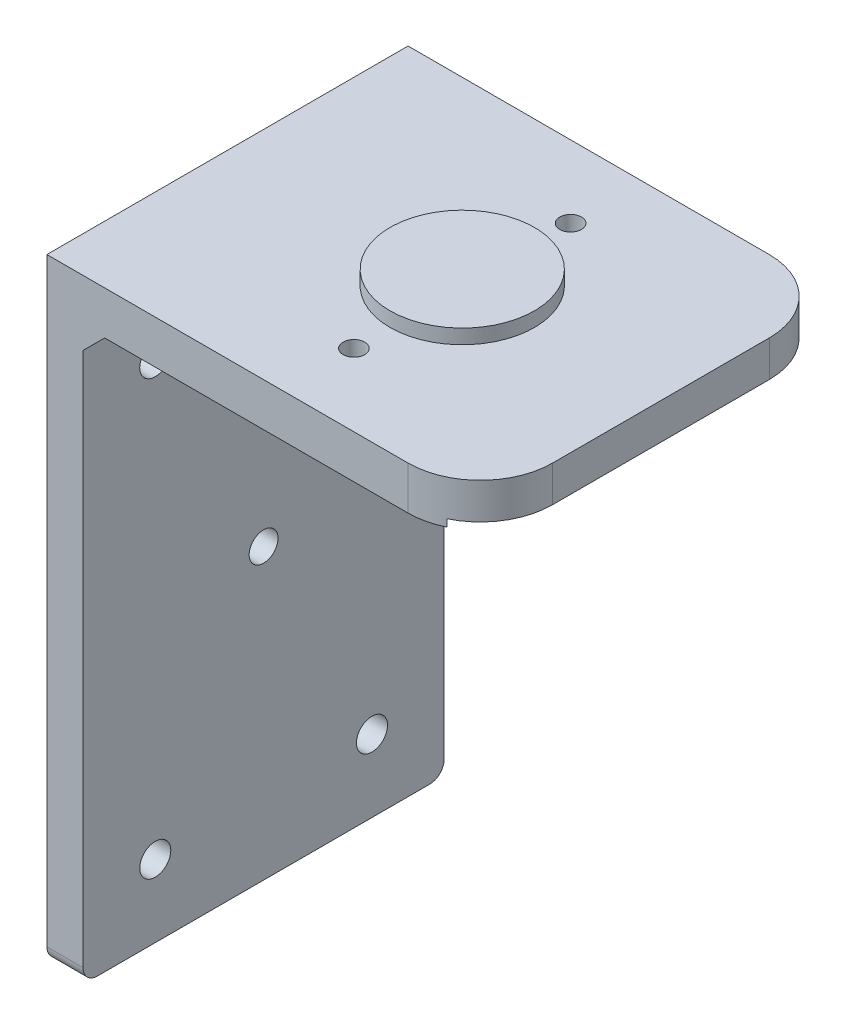
ISO-10303-21;
HEADER;
FILE_DESCRIPTION(('STEP AP214'),'2;1');
FILE_NAME('part.step','',(''),(''),'','','');
FILE_SCHEMA(('AUTOMOTIVE_DESIGN { 1 0 10303 214 1 1 1 1 }'));
ENDSEC;
DATA;
#1=APPLICATION_CONTEXT('core data for automotive mechanical design processes');
#2=APPLICATION_PROTOCOL_DEFINITION('international standard','automotive_design',2000,#1);
#3=PRODUCT_CONTEXT('',#1,'mechanical');
#4=PRODUCT('Part','Part','',(#3));
#5=PRODUCT_RELATED_PRODUCT_CATEGORY('part','',(#4));
#6=PRODUCT_DEFINITION_FORMATION('','',#4);
#7=PRODUCT_DEFINITION_CONTEXT('part definition',#1,'design');
#8=PRODUCT_DEFINITION('design','',#6,#7);
#9=PRODUCT_DEFINITION_SHAPE('','',#8);
#10=(LENGTH_UNIT() NAMED_UNIT(*) SI_UNIT(.MILLI.,.METRE.));
#11=(NAMED_UNIT(*) PLANE_ANGLE_UNIT() SI_UNIT($,.RADIAN.));
#12=(NAMED_UNIT(*) SI_UNIT($,.STERADIAN.) SOLID_ANGLE_UNIT());
#13=UNCERTAINTY_MEASURE_WITH_UNIT(LENGTH_MEASURE(1.E-05),#10,'distance_accuracy_value','');
#14=(GEOMETRIC_REPRESENTATION_CONTEXT(3) GLOBAL_UNCERTAINTY_ASSIGNED_CONTEXT((#13)) GLOBAL_UNIT_ASSIGNED_CONTEXT((#10,
#11,#12)) REPRESENTATION_CONTEXT('',''));
#15=CARTESIAN_POINT('',(0.,0.,0.));
#16=DIRECTION('',(0.,0.,1.));
#17=DIRECTION('',(1.,0.,0.));
#18=AXIS2_PLACEMENT_3D('',#15,#16,#17);
#19=CARTESIAN_POINT('',(-45.2656675749319,7.,22.0790190735695));
#20=DIRECTION('',(0.,-1.,0.));
#21=DIRECTION('',(0.,0.,-1.));
#22=AXIS2_PLACEMENT_3D('',#19,#20,#21);
#23=CYLINDRICAL_SURFACE('',#22,10.);
#24=CARTESIAN_POINT('',(-45.2656675749319,7.,22.0790190735695));
#25=DIRECTION('',(0.,1.,0.));
#26=DIRECTION('',(0.,0.,1.));
#27=AXIS2_PLACEMENT_3D('',#24,#25,#26);
#28=CIRCLE('',#27,10.);
#29=CARTESIAN_POINT('',(-45.2656675749319,7.,32.0790190735695));
#30=VERTEX_POINT('',#29);
#31=EDGE_CURVE('E11',#30,#30,#28,.T.);
#32=ORIENTED_EDGE('',*,*,#31,.F.);
#33=EDGE_LOOP('',(#32));
#34=FACE_BOUND('',#33,.T.);
#35=CARTESIAN_POINT('',(-45.2656675749319,5.,22.0790190735695));
#36=DIRECTION('',(0.,1.,0.));
#37=DIRECTION('',(0.,0.,1.));
#38=AXIS2_PLACEMENT_3D('',#35,#36,#37);
#39=CIRCLE('',#38,10.);
#40=CARTESIAN_POINT('',(-45.2656675749319,5.,32.0790190735695));
#41=VERTEX_POINT('',#40);
#42=EDGE_CURVE('E50',#41,#41,#39,.T.);
#43=ORIENTED_EDGE('',*,*,#42,.T.);
#44=EDGE_LOOP('',(#43));
#45=FACE_BOUND('',#44,.T.);
#46=ADVANCED_FACE('F47',(#34,#45),#23,.T.);
#47=CARTESIAN_POINT('',(-45.2656675749319,7.,22.0790190735695));
#48=DIRECTION('',(0.,1.,0.));
#49=DIRECTION('',(0.,0.,1.));
#50=AXIS2_PLACEMENT_3D('',#47,#48,#49);
#51=PLANE('',#50);
#52=ORIENTED_EDGE('',*,*,#31,.T.);
#53=EDGE_LOOP('',(#52));
#54=FACE_BOUND('',#53,.T.);
#55=ADVANCED_FACE('F62',(#54),#51,.T.);
#56=CARTESIAN_POINT('',(-45.2656675749319,5.,22.0790190735695));
#57=DIRECTION('',(0.,1.,0.));
#58=DIRECTION('',(0.,0.,1.));
#59=AXIS2_PLACEMENT_3D('',#56,#57,#58);
#60=PLANE('',#59);
#61=ORIENTED_EDGE('',*,*,#42,.F.);
#62=EDGE_LOOP('',(#61));
#63=FACE_BOUND('',#62,.T.);
#64=ADVANCED_FACE('F60',(#63),#60,.F.);
#65=CLOSED_SHELL('',(#46,#55,#64));
#66=MANIFOLD_SOLID_BREP('B2',#65);
#67=CARTESIAN_POINT('',(0.,0.,0.));
#68=DIRECTION('',(0.,1.,0.));
#69=DIRECTION('',(0.,0.,1.));
#70=AXIS2_PLACEMENT_3D('',#67,#68,#69);
#71=PLANE('',#70);
#72=CARTESIAN_POINT('',(-45.2656675749319,0.,7.07901907356949));
#73=DIRECTION('',(0.,1.,0.));
#74=DIRECTION('',(0.,0.,1.));
#75=AXIS2_PLACEMENT_3D('',#72,#73,#74);
#76=CIRCLE('',#75,1.5);
#77=CARTESIAN_POINT('',(-45.2656675749319,0.,8.57901907356949));
#78=VERTEX_POINT('',#77);
#79=EDGE_CURVE('E271',#78,#78,#76,.T.);
#80=ORIENTED_EDGE('',*,*,#79,.T.);
#81=EDGE_LOOP('',(#80));
#82=FACE_BOUND('',#81,.T.);
#83=CARTESIAN_POINT('',(-45.2656675749319,0.,37.0790190735695));
#84=DIRECTION('',(0.,1.,0.));
#85=DIRECTION('',(0.,0.,1.));
#86=AXIS2_PLACEMENT_3D('',#83,#84,#85);
#87=CIRCLE('',#86,1.5);
#88=CARTESIAN_POINT('',(-45.2656675749319,0.,38.5790190735695));
#89=VERTEX_POINT('',#88);
#90=EDGE_CURVE('E293',#89,#89,#87,.T.);
#91=ORIENTED_EDGE('',*,*,#90,.T.);
#92=EDGE_LOOP('',(#91));
#93=FACE_BOUND('',#92,.T.);
#94=CARTESIAN_POINT('',(-45.2656675749319,0.,22.0790190735695));
#95=DIRECTION('',(0.,1.,0.));
#96=DIRECTION('',(0.,0.,1.));
#97=AXIS2_PLACEMENT_3D('',#94,#95,#96);
#98=CIRCLE('',#97,10.);
#99=CARTESIAN_POINT('',(-45.2656675749319,0.,32.0790190735695));
#100=VERTEX_POINT('',#99);
#101=EDGE_CURVE('E276',#100,#100,#98,.T.);
#102=ORIENTED_EDGE('',*,*,#101,.T.);
#103=EDGE_LOOP('',(#102));
#104=FACE_BOUND('',#103,.T.);
#105=DIRECTION('',(-1.,0.,0.));
#106=VECTOR('',#105,1.);
#107=CARTESIAN_POINT('',(-17.7656675749319,0.,-1.92098092643051));
#108=LINE('',#107,#106);
#109=CARTESIAN_POINT('',(-23.4067686313912,0.,-1.92098092643051));
#110=VERTEX_POINT('',#109);
#111=CARTESIAN_POINT('',(-68.7656675749319,0.,-1.92098092643051));
#112=VERTEX_POINT('',#111);
#113=EDGE_CURVE('E224',#110,#112,#108,.T.);
#114=ORIENTED_EDGE('',*,*,#113,.F.);
#115=CARTESIAN_POINT('',(-27.7656675749319,0.,7.07901907356949));
#116=DIRECTION('',(0.,1.,0.));
#117=DIRECTION('',(0.,0.,1.));
#118=AXIS2_PLACEMENT_3D('',#115,#116,#117);
#119=CIRCLE('',#118,10.);
#120=CARTESIAN_POINT('',(-17.7656675749319,0.,7.07901907356948));
#121=VERTEX_POINT('',#120);
#122=EDGE_CURVE('E333',#110,#121,#119,.F.);
#123=ORIENTED_EDGE('',*,*,#122,.T.);
#124=DIRECTION('',(0.,0.,-1.));
#125=VECTOR('',#124,1.);
#126=CARTESIAN_POINT('',(-17.7656675749319,0.,0.));
#127=LINE('',#126,#125);
#128=CARTESIAN_POINT('',(-17.7656675749319,0.,37.0790190735695));
#129=VERTEX_POINT('',#128);
#130=EDGE_CURVE('E227',#129,#121,#127,.T.);
#131=ORIENTED_EDGE('',*,*,#130,.F.);
#132=CARTESIAN_POINT('',(-27.7656675749319,0.,37.0790190735695));
#133=DIRECTION('',(0.,1.,0.));
#134=DIRECTION('',(0.,0.,1.));
#135=AXIS2_PLACEMENT_3D('',#132,#133,#134);
#136=CIRCLE('',#135,10.);
#137=CARTESIAN_POINT('',(-23.4067686313912,0.,46.0790190735695));
#138=VERTEX_POINT('',#137);
#139=EDGE_CURVE('E331',#129,#138,#136,.F.);
#140=ORIENTED_EDGE('',*,*,#139,.T.);
#141=DIRECTION('',(1.,0.,0.));
#142=VECTOR('',#141,1.);
#143=CARTESIAN_POINT('',(-17.7656675749319,0.,46.0790190735695));
#144=LINE('',#143,#142);
#145=CARTESIAN_POINT('',(-68.7656675749319,0.,46.0790190735695));
#146=VERTEX_POINT('',#145);
#147=EDGE_CURVE('E201',#146,#138,#144,.T.);
#148=ORIENTED_EDGE('',*,*,#147,.F.);
#149=DIRECTION('',(0.,0.,1.));
#150=VECTOR('',#149,1.);
#151=CARTESIAN_POINT('',(-68.7656675749319,0.,47.0790190735695));
#152=LINE('',#151,#150);
#153=EDGE_CURVE('E219',#112,#146,#152,.T.);
#154=ORIENTED_EDGE('',*,*,#153,.F.);
#155=EDGE_LOOP('',(#114,#123,#131,#140,#148,#154));
#156=FACE_BOUND('',#155,.T.);
#157=ADVANCED_FACE('F88',(#82,#93,#104,#156),#71,.F.);
#158=CARTESIAN_POINT('',(-68.7656675749319,0.,47.0790190735695));
#159=DIRECTION('',(0.707106781186547,-0.707106781186548,0.));
#160=DIRECTION('',(0.707106781186548,0.707106781186547,0.));
#161=AXIS2_PLACEMENT_3D('',#158,#159,#160);
#162=PLANE('',#161);
#163=ORIENTED_EDGE('',*,*,#153,.T.);
#164=DIRECTION('',(-0.707106781186548,-0.707106781186547,0.));
#165=VECTOR('',#164,1.);
#166=CARTESIAN_POINT('',(-68.7656675749319,0.,46.0790190735695));
#167=LINE('',#166,#165);
#168=CARTESIAN_POINT('',(-69.7656675749319,-1.,46.0790190735695));
#169=VERTEX_POINT('',#168);
#170=EDGE_CURVE('E210',#146,#169,#167,.T.);
#171=ORIENTED_EDGE('',*,*,#170,.T.);
#172=DIRECTION('',(0.,0.,1.));
#173=VECTOR('',#172,1.);
#174=CARTESIAN_POINT('',(-69.7656675749319,-1.,47.0790190735695));
#175=LINE('',#174,#173);
#176=CARTESIAN_POINT('',(-69.7656675749319,-1.,47.0790190735695));
#177=VERTEX_POINT('',#176);
#178=EDGE_CURVE('E195',#169,#177,#175,.T.);
#179=ORIENTED_EDGE('',*,*,#178,.T.);
#180=DIRECTION('',(-0.707106781186548,-0.707106781186547,0.));
#181=VECTOR('',#180,1.);
#182=CARTESIAN_POINT('',(-68.7656675749319,0.,47.0790190735695));
#183=LINE('',#182,#181);
#184=CARTESIAN_POINT('',(-72.7656675749319,-4.,47.0790190735695));
#185=VERTEX_POINT('',#184);
#186=EDGE_CURVE('E207',#177,#185,#183,.T.);
#187=ORIENTED_EDGE('',*,*,#186,.T.);
#188=DIRECTION('',(0.,0.,-1.));
#189=VECTOR('',#188,1.);
#190=CARTESIAN_POINT('',(-72.7656675749319,-4.,-2.92098092643051));
#191=LINE('',#190,#189);
#192=CARTESIAN_POINT('',(-72.7656675749319,-4.,-2.92098092643051));
#193=VERTEX_POINT('',#192);
#194=EDGE_CURVE('E216',#185,#193,#191,.T.);
#195=ORIENTED_EDGE('',*,*,#194,.T.);
#196=DIRECTION('',(-0.707106781186548,-0.707106781186547,0.));
#197=VECTOR('',#196,1.);
#198=CARTESIAN_POINT('',(-68.7656675749319,0.,-2.92098092643051));
#199=LINE('',#198,#197);
#200=CARTESIAN_POINT('',(-69.7656675749319,-1.,-2.92098092643051));
#201=VERTEX_POINT('',#200);
#202=EDGE_CURVE('E217',#201,#193,#199,.T.);
#203=ORIENTED_EDGE('',*,*,#202,.F.);
#204=DIRECTION('',(0.,0.,1.));
#205=VECTOR('',#204,1.);
#206=CARTESIAN_POINT('',(-69.7656675749319,-1.,47.0790190735695));
#207=LINE('',#206,#205);
#208=CARTESIAN_POINT('',(-69.7656675749319,-1.,-1.92098092643051));
#209=VERTEX_POINT('',#208);
#210=EDGE_CURVE('E374',#201,#209,#207,.T.);
#211=ORIENTED_EDGE('',*,*,#210,.T.);
#212=DIRECTION('',(0.707106781186548,0.707106781186547,0.));
#213=VECTOR('',#212,1.);
#214=CARTESIAN_POINT('',(-68.7656675749319,0.,-1.92098092643051));
#215=LINE('',#214,#213);
#216=EDGE_CURVE('E370',#209,#112,#215,.T.);
#217=ORIENTED_EDGE('',*,*,#216,.T.);
#218=EDGE_LOOP('',(#163,#171,#179,#187,#195,#203,#211,#217));
#219=FACE_BOUND('',#218,.T.);
#220=ADVANCED_FACE('F205',(#219),#162,.T.);
#221=CARTESIAN_POINT('',(0.,5.,-2.92098092643051));
#222=DIRECTION('',(0.,0.,-1.));
#223=DIRECTION('',(-1.,0.,0.));
#224=AXIS2_PLACEMENT_3D('',#221,#222,#223);
#225=PLANE('',#224);
#226=DIRECTION('',(1.,0.,0.));
#227=VECTOR('',#226,1.);
#228=CARTESIAN_POINT('',(0.,5.,-2.92098092643051));
#229=LINE('',#228,#227);
#230=CARTESIAN_POINT('',(-77.7656675749319,5.,-2.92098092643051));
#231=VERTEX_POINT('',#230);
#232=CARTESIAN_POINT('',(-27.7656675749319,5.,-2.92098092643051));
#233=VERTEX_POINT('',#232);
#234=EDGE_CURVE('E272',#231,#233,#229,.T.);
#235=ORIENTED_EDGE('',*,*,#234,.T.);
#236=DIRECTION('',(0.,-1.,0.));
#237=VECTOR('',#236,1.);
#238=CARTESIAN_POINT('',(-27.7656675749319,-1.,-2.92098092643051));
#239=LINE('',#238,#237);
#240=CARTESIAN_POINT('',(-27.7656675749319,-1.,-2.92098092643051));
#241=VERTEX_POINT('',#240);
#242=EDGE_CURVE('E324',#233,#241,#239,.T.);
#243=ORIENTED_EDGE('',*,*,#242,.T.);
#244=DIRECTION('',(1.,0.,0.));
#245=VECTOR('',#244,1.);
#246=CARTESIAN_POINT('',(-18.7656675749319,-1.,-2.92098092643051));
#247=LINE('',#246,#245);
#248=EDGE_CURVE('E365',#201,#241,#247,.T.);
#249=ORIENTED_EDGE('',*,*,#248,.F.);
#250=ORIENTED_EDGE('',*,*,#202,.T.);
#251=DIRECTION('',(0.,1.,0.));
#252=VECTOR('',#251,1.);
#253=CARTESIAN_POINT('',(-72.7656675749319,-80.,-2.92098092643051));
#254=LINE('',#253,#252);
#255=CARTESIAN_POINT('',(-72.7656675749319,-78.,-2.92098092643051));
#256=VERTEX_POINT('',#255);
#257=EDGE_CURVE('E268',#256,#193,#254,.T.);
#258=ORIENTED_EDGE('',*,*,#257,.F.);
#259=DIRECTION('',(1.,0.,0.));
#260=VECTOR('',#259,1.);
#261=CARTESIAN_POINT('',(-77.7656675749319,-78.,-2.92098092643051));
#262=LINE('',#261,#260);
#263=CARTESIAN_POINT('',(-77.7656675749319,-78.,-2.92098092643051));
#264=VERTEX_POINT('',#263);
#265=EDGE_CURVE('E322',#256,#264,#262,.F.);
#266=ORIENTED_EDGE('',*,*,#265,.T.);
#267=DIRECTION('',(0.,-1.,0.));
#268=VECTOR('',#267,1.);
#269=CARTESIAN_POINT('',(-77.7656675749319,5.,-2.92098092643051));
#270=LINE('',#269,#268);
#271=EDGE_CURVE('E300',#231,#264,#270,.T.);
#272=ORIENTED_EDGE('',*,*,#271,.F.);
#273=EDGE_LOOP('',(#235,#243,#249,#250,#258,#266,#272));
#274=FACE_BOUND('',#273,.T.);
#275=ADVANCED_FACE('F355',(#274),#225,.T.);
#276=CARTESIAN_POINT('',(0.,5.,47.0790190735695));
#277=DIRECTION('',(0.,0.,1.));
#278=DIRECTION('',(1.,0.,0.));
#279=AXIS2_PLACEMENT_3D('',#276,#277,#278);
#280=PLANE('',#279);
#281=DIRECTION('',(-1.,0.,0.));
#282=VECTOR('',#281,1.);
#283=CARTESIAN_POINT('',(-18.7656675749319,-1.,47.0790190735695));
#284=LINE('',#283,#282);
#285=CARTESIAN_POINT('',(-27.7656675749319,-1.,47.0790190735695));
#286=VERTEX_POINT('',#285);
#287=EDGE_CURVE('E192',#286,#177,#284,.T.);
#288=ORIENTED_EDGE('',*,*,#287,.F.);
#289=DIRECTION('',(0.,-1.,0.));
#290=VECTOR('',#289,1.);
#291=CARTESIAN_POINT('',(-27.7656675749319,5.,47.0790190735695));
#292=LINE('',#291,#290);
#293=CARTESIAN_POINT('',(-27.7656675749319,5.,47.0790190735695));
#294=VERTEX_POINT('',#293);
#295=EDGE_CURVE('E45',#286,#294,#292,.F.);
#296=ORIENTED_EDGE('',*,*,#295,.T.);
#297=DIRECTION('',(-1.,0.,0.));
#298=VECTOR('',#297,1.);
#299=CARTESIAN_POINT('',(0.,5.,47.0790190735695));
#300=LINE('',#299,#298);
#301=CARTESIAN_POINT('',(-77.7656675749319,5.,47.0790190735695));
#302=VERTEX_POINT('',#301);
#303=EDGE_CURVE('E279',#294,#302,#300,.T.);
#304=ORIENTED_EDGE('',*,*,#303,.T.);
#305=DIRECTION('',(0.,-1.,0.));
#306=VECTOR('',#305,1.);
#307=CARTESIAN_POINT('',(-77.7656675749319,5.,47.0790190735695));
#308=LINE('',#307,#306);
#309=CARTESIAN_POINT('',(-77.7656675749319,-78.,47.0790190735695));
#310=VERTEX_POINT('',#309);
#311=EDGE_CURVE('E290',#302,#310,#308,.T.);
#312=ORIENTED_EDGE('',*,*,#311,.T.);
#313=DIRECTION('',(-1.,0.,0.));
#314=VECTOR('',#313,1.);
#315=CARTESIAN_POINT('',(-72.7656675749319,-78.,47.0790190735695));
#316=LINE('',#315,#314);
#317=CARTESIAN_POINT('',(-72.7656675749319,-78.,47.0790190735695));
#318=VERTEX_POINT('',#317);
#319=EDGE_CURVE('E316',#310,#318,#316,.F.);
#320=ORIENTED_EDGE('',*,*,#319,.T.);
#321=DIRECTION('',(0.,1.,0.));
#322=VECTOR('',#321,1.);
#323=CARTESIAN_POINT('',(-72.7656675749319,-80.,47.0790190735695));
#324=LINE('',#323,#322);
#325=EDGE_CURVE('E215',#318,#185,#324,.T.);
#326=ORIENTED_EDGE('',*,*,#325,.T.);
#327=ORIENTED_EDGE('',*,*,#186,.F.);
#328=EDGE_LOOP('',(#288,#296,#304,#312,#320,#326,#327));
#329=FACE_BOUND('',#328,.T.);
#330=ADVANCED_FACE('F213',(#329),#280,.T.);
#331=CARTESIAN_POINT('',(-72.7656675749319,-80.,47.0790190735695));
#332=DIRECTION('',(-1.,0.,0.));
#333=DIRECTION('',(0.,0.,1.));
#334=AXIS2_PLACEMENT_3D('',#331,#332,#333);
#335=PLANE('',#334);
#336=CARTESIAN_POINT('',(-72.7656675749319,-70.,37.0790190735695));
#337=DIRECTION('',(1.,0.,0.));
#338=DIRECTION('',(0.,0.,-1.));
#339=AXIS2_PLACEMENT_3D('',#336,#337,#338);
#340=CIRCLE('',#339,2.15);
#341=CARTESIAN_POINT('',(-72.7656675749319,-70.,34.9290190735695));
#342=VERTEX_POINT('',#341);
#343=EDGE_CURVE('E245',#342,#342,#340,.T.);
#344=ORIENTED_EDGE('',*,*,#343,.F.);
#345=EDGE_LOOP('',(#344));
#346=FACE_BOUND('',#345,.T.);
#347=CARTESIAN_POINT('',(-72.7656675749319,-70.,7.07901907356949));
#348=DIRECTION('',(-1.,0.,0.));
#349=DIRECTION('',(0.,0.,1.));
#350=AXIS2_PLACEMENT_3D('',#347,#348,#349);
#351=CIRCLE('',#350,2.15);
#352=CARTESIAN_POINT('',(-72.7656675749319,-70.,9.22901907356949));
#353=VERTEX_POINT('',#352);
#354=EDGE_CURVE('E239',#353,#353,#351,.T.);
#355=ORIENTED_EDGE('',*,*,#354,.T.);
#356=EDGE_LOOP('',(#355));
#357=FACE_BOUND('',#356,.T.);
#358=CARTESIAN_POINT('',(-72.7656675749319,-40.,22.0790190735695));
#359=DIRECTION('',(1.,0.,0.));
#360=DIRECTION('',(0.,0.,-1.));
#361=AXIS2_PLACEMENT_3D('',#358,#359,#360);
#362=CIRCLE('',#361,2.);
#363=CARTESIAN_POINT('',(-72.7656675749319,-40.,20.0790190735695));
#364=VERTEX_POINT('',#363);
#365=EDGE_CURVE('E253',#364,#364,#362,.T.);
#366=ORIENTED_EDGE('',*,*,#365,.F.);
#367=EDGE_LOOP('',(#366));
#368=FACE_BOUND('',#367,.T.);
#369=CARTESIAN_POINT('',(-72.7656675749319,-10.,37.0790190735695));
#370=DIRECTION('',(-1.,0.,0.));
#371=DIRECTION('',(0.,0.,1.));
#372=AXIS2_PLACEMENT_3D('',#369,#370,#371);
#373=CIRCLE('',#372,2.15);
#374=CARTESIAN_POINT('',(-72.7656675749319,-10.,39.2290190735695));
#375=VERTEX_POINT('',#374);
#376=EDGE_CURVE('E235',#375,#375,#373,.T.);
#377=ORIENTED_EDGE('',*,*,#376,.T.);
#378=EDGE_LOOP('',(#377));
#379=FACE_BOUND('',#378,.T.);
#380=CARTESIAN_POINT('',(-72.7656675749319,-10.,7.07901907356949));
#381=DIRECTION('',(1.,0.,0.));
#382=DIRECTION('',(0.,0.,-1.));
#383=AXIS2_PLACEMENT_3D('',#380,#381,#382);
#384=CIRCLE('',#383,2.15);
#385=CARTESIAN_POINT('',(-72.7656675749319,-10.,4.92901907356949));
#386=VERTEX_POINT('',#385);
#387=EDGE_CURVE('E232',#386,#386,#384,.T.);
#388=ORIENTED_EDGE('',*,*,#387,.F.);
#389=EDGE_LOOP('',(#388));
#390=FACE_BOUND('',#389,.T.);
#391=ORIENTED_EDGE('',*,*,#194,.F.);
#392=ORIENTED_EDGE('',*,*,#325,.F.);
#393=CARTESIAN_POINT('',(-72.7656675749319,-78.,45.0790190735695));
#394=DIRECTION('',(-1.,0.,0.));
#395=DIRECTION('',(0.,0.,1.));
#396=AXIS2_PLACEMENT_3D('',#393,#394,#395);
#397=CIRCLE('',#396,2.);
#398=CARTESIAN_POINT('',(-72.7656675749319,-80.,45.0790190735695));
#399=VERTEX_POINT('',#398);
#400=EDGE_CURVE('E320',#318,#399,#397,.F.);
#401=ORIENTED_EDGE('',*,*,#400,.T.);
#402=DIRECTION('',(0.,0.,1.));
#403=VECTOR('',#402,1.);
#404=CARTESIAN_POINT('',(-72.7656675749319,-80.,47.0790190735695));
#405=LINE('',#404,#403);
#406=CARTESIAN_POINT('',(-72.7656675749319,-80.,-0.92098092643051));
#407=VERTEX_POINT('',#406);
#408=EDGE_CURVE('E264',#407,#399,#405,.T.);
#409=ORIENTED_EDGE('',*,*,#408,.F.);
#410=CARTESIAN_POINT('',(-72.7656675749319,-78.,-0.920980926430511));
#411=DIRECTION('',(-1.,0.,0.));
#412=DIRECTION('',(0.,0.,1.));
#413=AXIS2_PLACEMENT_3D('',#410,#411,#412);
#414=CIRCLE('',#413,2.);
#415=EDGE_CURVE('E318',#407,#256,#414,.F.);
#416=ORIENTED_EDGE('',*,*,#415,.T.);
#417=ORIENTED_EDGE('',*,*,#257,.T.);
#418=EDGE_LOOP('',(#391,#392,#401,#409,#416,#417));
#419=FACE_BOUND('',#418,.T.);
#420=ADVANCED_FACE('F396',(#346,#357,#368,#379,#390,#419),#335,.F.);
#421=CARTESIAN_POINT('',(-77.7656675749319,5.,0.));
#422=DIRECTION('',(-1.,0.,0.));
#423=DIRECTION('',(0.,0.,1.));
#424=AXIS2_PLACEMENT_3D('',#421,#422,#423);
#425=PLANE('',#424);
#426=CARTESIAN_POINT('',(-77.7656675749319,-70.,7.07901907356949));
#427=DIRECTION('',(-1.,0.,0.));
#428=DIRECTION('',(0.,0.,1.));
#429=AXIS2_PLACEMENT_3D('',#426,#427,#428);
#430=CIRCLE('',#429,2.15);
#431=CARTESIAN_POINT('',(-77.7656675749319,-70.,9.22901907356949));
#432=VERTEX_POINT('',#431);
#433=EDGE_CURVE('E242',#432,#432,#430,.T.);
#434=ORIENTED_EDGE('',*,*,#433,.F.);
#435=EDGE_LOOP('',(#434));
#436=FACE_BOUND('',#435,.T.);
#437=CARTESIAN_POINT('',(-77.7656675749319,-10.,37.0790190735695));
#438=DIRECTION('',(-1.,0.,0.));
#439=DIRECTION('',(0.,0.,1.));
#440=AXIS2_PLACEMENT_3D('',#437,#438,#439);
#441=CIRCLE('',#440,2.15);
#442=CARTESIAN_POINT('',(-77.7656675749319,-10.,39.2290190735695));
#443=VERTEX_POINT('',#442);
#444=EDGE_CURVE('E250',#443,#443,#441,.T.);
#445=ORIENTED_EDGE('',*,*,#444,.F.);
#446=EDGE_LOOP('',(#445));
#447=FACE_BOUND('',#446,.T.);
#448=CARTESIAN_POINT('',(-77.7656675749319,-40.,22.0790190735695));
#449=DIRECTION('',(-1.,0.,0.));
#450=DIRECTION('',(0.,0.,1.));
#451=AXIS2_PLACEMENT_3D('',#448,#449,#450);
#452=CIRCLE('',#451,2.);
#453=CARTESIAN_POINT('',(-77.7656675749319,-40.,24.0790190735695));
#454=VERTEX_POINT('',#453);
#455=EDGE_CURVE('E258',#454,#454,#452,.T.);
#456=ORIENTED_EDGE('',*,*,#455,.F.);
#457=EDGE_LOOP('',(#456));
#458=FACE_BOUND('',#457,.T.);
#459=DIRECTION('',(0.,0.,-1.));
#460=VECTOR('',#459,1.);
#461=CARTESIAN_POINT('',(-77.7656675749319,-80.,-2.92098092643051));
#462=LINE('',#461,#460);
#463=CARTESIAN_POINT('',(-77.7656675749319,-80.,45.0790190735695));
#464=VERTEX_POINT('',#463);
#465=CARTESIAN_POINT('',(-77.7656675749319,-80.,-0.920980926430511));
#466=VERTEX_POINT('',#465);
#467=EDGE_CURVE('E261',#464,#466,#462,.T.);
#468=ORIENTED_EDGE('',*,*,#467,.F.);
#469=CARTESIAN_POINT('',(-77.7656675749319,-78.,45.0790190735695));
#470=DIRECTION('',(-1.,0.,0.));
#471=DIRECTION('',(0.,0.,1.));
#472=AXIS2_PLACEMENT_3D('',#469,#470,#471);
#473=CIRCLE('',#472,2.);
#474=EDGE_CURVE('E314',#464,#310,#473,.T.);
#475=ORIENTED_EDGE('',*,*,#474,.T.);
#476=ORIENTED_EDGE('',*,*,#311,.F.);
#477=DIRECTION('',(0.,0.,-1.));
#478=VECTOR('',#477,1.);
#479=CARTESIAN_POINT('',(-77.7656675749319,5.,0.));
#480=LINE('',#479,#478);
#481=EDGE_CURVE('E275',#302,#231,#480,.T.);
#482=ORIENTED_EDGE('',*,*,#481,.T.);
#483=ORIENTED_EDGE('',*,*,#271,.T.);
#484=CARTESIAN_POINT('',(-77.7656675749319,-78.,-0.920980926430511));
#485=DIRECTION('',(-1.,0.,0.));
#486=DIRECTION('',(0.,0.,1.));
#487=AXIS2_PLACEMENT_3D('',#484,#485,#486);
#488=CIRCLE('',#487,2.);
#489=EDGE_CURVE('E312',#264,#466,#488,.T.);
#490=ORIENTED_EDGE('',*,*,#489,.T.);
#491=EDGE_LOOP('',(#468,#475,#476,#482,#483,#490));
#492=FACE_BOUND('',#491,.T.);
#493=CARTESIAN_POINT('',(-77.7656675749319,-10.,7.07901907356949));
#494=DIRECTION('',(1.,0.,0.));
#495=DIRECTION('',(0.,0.,-1.));
#496=AXIS2_PLACEMENT_3D('',#493,#494,#495);
#497=CIRCLE('',#496,2.15);
#498=CARTESIAN_POINT('',(-77.7656675749319,-10.,4.92901907356949));
#499=VERTEX_POINT('',#498);
#500=EDGE_CURVE('E236',#499,#499,#497,.T.);
#501=ORIENTED_EDGE('',*,*,#500,.T.);
#502=EDGE_LOOP('',(#501));
#503=FACE_BOUND('',#502,.T.);
#504=CARTESIAN_POINT('',(-77.7656675749319,-70.,37.0790190735695));
#505=DIRECTION('',(1.,0.,0.));
#506=DIRECTION('',(0.,0.,-1.));
#507=AXIS2_PLACEMENT_3D('',#504,#505,#506);
#508=CIRCLE('',#507,2.15);
#509=CARTESIAN_POINT('',(-77.7656675749319,-70.,34.9290190735695));
#510=VERTEX_POINT('',#509);
#511=EDGE_CURVE('E231',#510,#510,#508,.T.);
#512=ORIENTED_EDGE('',*,*,#511,.T.);
#513=EDGE_LOOP('',(#512));
#514=FACE_BOUND('',#513,.T.);
#515=ADVANCED_FACE('F386',(#436,#447,#458,#492,#503,#514),#425,.T.);
#516=CARTESIAN_POINT('',(-45.2656675749319,5.,37.0790190735695));
#517=DIRECTION('',(0.,-1.,0.));
#518=DIRECTION('',(0.,0.,-1.));
#519=AXIS2_PLACEMENT_3D('',#516,#517,#518);
#520=CYLINDRICAL_SURFACE('',#519,1.5);
#521=CARTESIAN_POINT('',(-45.2656675749319,5.,37.0790190735695));
#522=DIRECTION('',(0.,1.,0.));
#523=DIRECTION('',(0.,0.,1.));
#524=AXIS2_PLACEMENT_3D('',#521,#522,#523);
#525=CIRCLE('',#524,1.5);
#526=CARTESIAN_POINT('',(-45.2656675749319,5.,38.5790190735695));
#527=VERTEX_POINT('',#526);
#528=EDGE_CURVE('E284',#527,#527,#525,.T.);
#529=ORIENTED_EDGE('',*,*,#528,.T.);
#530=EDGE_LOOP('',(#529));
#531=FACE_BOUND('',#530,.T.);
#532=ORIENTED_EDGE('',*,*,#90,.F.);
#533=EDGE_LOOP('',(#532));
#534=FACE_BOUND('',#533,.T.);
#535=ADVANCED_FACE('F433',(#531,#534),#520,.F.);
#536=CARTESIAN_POINT('',(-45.2656675749319,5.,7.07901907356949));
#537=DIRECTION('',(0.,-1.,0.));
#538=DIRECTION('',(0.,0.,-1.));
#539=AXIS2_PLACEMENT_3D('',#536,#537,#538);
#540=CYLINDRICAL_SURFACE('',#539,1.5);
#541=CARTESIAN_POINT('',(-45.2656675749319,5.,7.07901907356949));
#542=DIRECTION('',(0.,1.,0.));
#543=DIRECTION('',(0.,0.,1.));
#544=AXIS2_PLACEMENT_3D('',#541,#542,#543);
#545=CIRCLE('',#544,1.5);
#546=CARTESIAN_POINT('',(-45.2656675749319,5.,8.57901907356949));
#547=VERTEX_POINT('',#546);
#548=EDGE_CURVE('E281',#547,#547,#545,.T.);
#549=ORIENTED_EDGE('',*,*,#548,.T.);
#550=EDGE_LOOP('',(#549));
#551=FACE_BOUND('',#550,.T.);
#552=ORIENTED_EDGE('',*,*,#79,.F.);
#553=EDGE_LOOP('',(#552));
#554=FACE_BOUND('',#553,.T.);
#555=ADVANCED_FACE('F431',(#551,#554),#540,.F.);
#556=CARTESIAN_POINT('',(-45.2656675749319,5.,22.0790190735695));
#557=DIRECTION('',(0.,-1.,0.));
#558=DIRECTION('',(0.,0.,-1.));
#559=AXIS2_PLACEMENT_3D('',#556,#557,#558);
#560=CYLINDRICAL_SURFACE('',#559,10.);
#561=CARTESIAN_POINT('',(-45.2656675749319,5.,22.0790190735695));
#562=DIRECTION('',(0.,1.,0.));
#563=DIRECTION('',(0.,0.,1.));
#564=AXIS2_PLACEMENT_3D('',#561,#562,#563);
#565=CIRCLE('',#564,10.);
#566=CARTESIAN_POINT('',(-45.2656675749319,5.,32.0790190735695));
#567=VERTEX_POINT('',#566);
#568=EDGE_CURVE('E287',#567,#567,#565,.T.);
#569=ORIENTED_EDGE('',*,*,#568,.T.);
#570=EDGE_LOOP('',(#569));
#571=FACE_BOUND('',#570,.T.);
#572=ORIENTED_EDGE('',*,*,#101,.F.);
#573=EDGE_LOOP('',(#572));
#574=FACE_BOUND('',#573,.T.);
#575=ADVANCED_FACE('F428',(#571,#574),#560,.F.);
#576=CARTESIAN_POINT('',(0.,5.,0.));
#577=DIRECTION('',(0.,1.,0.));
#578=DIRECTION('',(0.,0.,1.));
#579=AXIS2_PLACEMENT_3D('',#576,#577,#578);
#580=PLANE('',#579);
#581=DIRECTION('',(0.,0.,1.));
#582=VECTOR('',#581,1.);
#583=CARTESIAN_POINT('',(-17.7656675749319,5.,0.));
#584=LINE('',#583,#582);
#585=CARTESIAN_POINT('',(-17.7656675749319,5.,7.07901907356948));
#586=VERTEX_POINT('',#585);
#587=CARTESIAN_POINT('',(-17.7656675749319,5.,37.0790190735695));
#588=VERTEX_POINT('',#587);
#589=EDGE_CURVE('E303',#586,#588,#584,.T.);
#590=ORIENTED_EDGE('',*,*,#589,.F.);
#591=CARTESIAN_POINT('',(-27.7656675749319,5.,7.07901907356949));
#592=DIRECTION('',(0.,1.,0.));
#593=DIRECTION('',(0.,0.,1.));
#594=AXIS2_PLACEMENT_3D('',#591,#592,#593);
#595=CIRCLE('',#594,10.);
#596=EDGE_CURVE('E342',#586,#233,#595,.T.);
#597=ORIENTED_EDGE('',*,*,#596,.T.);
#598=ORIENTED_EDGE('',*,*,#234,.F.);
#599=ORIENTED_EDGE('',*,*,#481,.F.);
#600=ORIENTED_EDGE('',*,*,#303,.F.);
#601=CARTESIAN_POINT('',(-27.7656675749319,5.,37.0790190735695));
#602=DIRECTION('',(0.,1.,0.));
#603=DIRECTION('',(0.,0.,1.));
#604=AXIS2_PLACEMENT_3D('',#601,#602,#603);
#605=CIRCLE('',#604,10.);
#606=EDGE_CURVE('E340',#294,#588,#605,.T.);
#607=ORIENTED_EDGE('',*,*,#606,.T.);
#608=EDGE_LOOP('',(#590,#597,#598,#599,#600,#607));
#609=FACE_BOUND('',#608,.T.);
#610=ORIENTED_EDGE('',*,*,#548,.F.);
#611=EDGE_LOOP('',(#610));
#612=FACE_BOUND('',#611,.T.);
#613=ORIENTED_EDGE('',*,*,#528,.F.);
#614=EDGE_LOOP('',(#613));
#615=FACE_BOUND('',#614,.T.);
#616=ORIENTED_EDGE('',*,*,#568,.F.);
#617=EDGE_LOOP('',(#616));
#618=FACE_BOUND('',#617,.T.);
#619=ADVANCED_FACE('F348',(#609,#612,#615,#618),#580,.T.);
#620=CARTESIAN_POINT('',(0.,-80.,0.));
#621=DIRECTION('',(0.,1.,0.));
#622=DIRECTION('',(0.,0.,1.));
#623=AXIS2_PLACEMENT_3D('',#620,#621,#622);
#624=PLANE('',#623);
#625=ORIENTED_EDGE('',*,*,#408,.T.);
#626=DIRECTION('',(-1.,0.,0.));
#627=VECTOR('',#626,1.);
#628=CARTESIAN_POINT('',(-77.7656675749319,-80.,45.0790190735695));
#629=LINE('',#628,#627);
#630=EDGE_CURVE('E309',#399,#464,#629,.T.);
#631=ORIENTED_EDGE('',*,*,#630,.T.);
#632=ORIENTED_EDGE('',*,*,#467,.T.);
#633=DIRECTION('',(1.,0.,0.));
#634=VECTOR('',#633,1.);
#635=CARTESIAN_POINT('',(-72.7656675749319,-80.,-0.920980926430511));
#636=LINE('',#635,#634);
#637=EDGE_CURVE('E306',#466,#407,#636,.T.);
#638=ORIENTED_EDGE('',*,*,#637,.T.);
#639=EDGE_LOOP('',(#625,#631,#632,#638));
#640=FACE_BOUND('',#639,.T.);
#641=ADVANCED_FACE('F398',(#640),#624,.F.);
#642=CARTESIAN_POINT('',(-112.765667574932,-40.,22.0790190735695));
#643=DIRECTION('',(1.,0.,0.));
#644=DIRECTION('',(0.,0.,-1.));
#645=AXIS2_PLACEMENT_3D('',#642,#643,#644);
#646=CYLINDRICAL_SURFACE('',#645,2.);
#647=ORIENTED_EDGE('',*,*,#455,.T.);
#648=EDGE_LOOP('',(#647));
#649=FACE_BOUND('',#648,.T.);
#650=ORIENTED_EDGE('',*,*,#365,.T.);
#651=EDGE_LOOP('',(#650));
#652=FACE_BOUND('',#651,.T.);
#653=ADVANCED_FACE('F566',(#649,#652),#646,.F.);
#654=CARTESIAN_POINT('',(-77.7656675749319,-10.,37.0790190735695));
#655=DIRECTION('',(1.,0.,0.));
#656=DIRECTION('',(0.,0.,-1.));
#657=AXIS2_PLACEMENT_3D('',#654,#655,#656);
#658=CYLINDRICAL_SURFACE('',#657,2.15);
#659=ORIENTED_EDGE('',*,*,#444,.T.);
#660=EDGE_LOOP('',(#659));
#661=FACE_BOUND('',#660,.T.);
#662=ORIENTED_EDGE('',*,*,#376,.F.);
#663=EDGE_LOOP('',(#662));
#664=FACE_BOUND('',#663,.T.);
#665=ADVANCED_FACE('F604',(#661,#664),#658,.F.);
#666=CARTESIAN_POINT('',(-77.7656675749319,-10.,7.07901907356949));
#667=DIRECTION('',(1.,0.,0.));
#668=DIRECTION('',(0.,0.,-1.));
#669=AXIS2_PLACEMENT_3D('',#666,#667,#668);
#670=CYLINDRICAL_SURFACE('',#669,2.15);
#671=ORIENTED_EDGE('',*,*,#500,.F.);
#672=EDGE_LOOP('',(#671));
#673=FACE_BOUND('',#672,.T.);
#674=ORIENTED_EDGE('',*,*,#387,.T.);
#675=EDGE_LOOP('',(#674));
#676=FACE_BOUND('',#675,.T.);
#677=ADVANCED_FACE('F594',(#673,#676),#670,.F.);
#678=CARTESIAN_POINT('',(-77.7656675749319,-70.,7.07901907356949));
#679=DIRECTION('',(1.,0.,0.));
#680=DIRECTION('',(0.,0.,-1.));
#681=AXIS2_PLACEMENT_3D('',#678,#679,#680);
#682=CYLINDRICAL_SURFACE('',#681,2.15);
#683=ORIENTED_EDGE('',*,*,#433,.T.);
#684=EDGE_LOOP('',(#683));
#685=FACE_BOUND('',#684,.T.);
#686=ORIENTED_EDGE('',*,*,#354,.F.);
#687=EDGE_LOOP('',(#686));
#688=FACE_BOUND('',#687,.T.);
#689=ADVANCED_FACE('F584',(#685,#688),#682,.F.);
#690=CARTESIAN_POINT('',(-77.7656675749319,-70.,37.0790190735695));
#691=DIRECTION('',(1.,0.,0.));
#692=DIRECTION('',(0.,0.,-1.));
#693=AXIS2_PLACEMENT_3D('',#690,#691,#692);
#694=CYLINDRICAL_SURFACE('',#693,2.15);
#695=ORIENTED_EDGE('',*,*,#511,.F.);
#696=EDGE_LOOP('',(#695));
#697=FACE_BOUND('',#696,.T.);
#698=ORIENTED_EDGE('',*,*,#343,.T.);
#699=EDGE_LOOP('',(#698));
#700=FACE_BOUND('',#699,.T.);
#701=ADVANCED_FACE('F501',(#697,#700),#694,.F.);
#702=CARTESIAN_POINT('',(-17.7656675749319,10.,0.));
#703=DIRECTION('',(-1.,0.,0.));
#704=DIRECTION('',(0.,0.,1.));
#705=AXIS2_PLACEMENT_3D('',#702,#703,#704);
#706=PLANE('',#705);
#707=ORIENTED_EDGE('',*,*,#130,.T.);
#708=DIRECTION('',(0.,-1.,0.));
#709=VECTOR('',#708,1.);
#710=CARTESIAN_POINT('',(-17.7656675749319,5.,7.07901907356948));
#711=LINE('',#710,#709);
#712=EDGE_CURVE('E338',#121,#586,#711,.F.);
#713=ORIENTED_EDGE('',*,*,#712,.T.);
#714=ORIENTED_EDGE('',*,*,#589,.T.);
#715=DIRECTION('',(0.,-1.,0.));
#716=VECTOR('',#715,1.);
#717=CARTESIAN_POINT('',(-17.7656675749319,-0.999999999999999,37.0790190735695));
#718=LINE('',#717,#716);
#719=EDGE_CURVE('E335',#588,#129,#718,.T.);
#720=ORIENTED_EDGE('',*,*,#719,.T.);
#721=EDGE_LOOP('',(#707,#713,#714,#720));
#722=FACE_BOUND('',#721,.T.);
#723=ADVANCED_FACE('F449',(#722),#706,.F.);
#724=CARTESIAN_POINT('',(0.,-78.,45.0790190735695));
#725=DIRECTION('',(1.,0.,0.));
#726=DIRECTION('',(0.,0.,-1.));
#727=AXIS2_PLACEMENT_3D('',#724,#725,#726);
#728=CYLINDRICAL_SURFACE('',#727,2.);
#729=ORIENTED_EDGE('',*,*,#400,.F.);
#730=ORIENTED_EDGE('',*,*,#319,.F.);
#731=ORIENTED_EDGE('',*,*,#474,.F.);
#732=ORIENTED_EDGE('',*,*,#630,.F.);
#733=EDGE_LOOP('',(#729,#730,#731,#732));
#734=FACE_BOUND('',#733,.T.);
#735=ADVANCED_FACE('F392',(#734),#728,.T.);
#736=CARTESIAN_POINT('',(0.,-78.,-0.920980926430511));
#737=DIRECTION('',(-1.,0.,0.));
#738=DIRECTION('',(0.,0.,1.));
#739=AXIS2_PLACEMENT_3D('',#736,#737,#738);
#740=CYLINDRICAL_SURFACE('',#739,2.);
#741=ORIENTED_EDGE('',*,*,#489,.F.);
#742=ORIENTED_EDGE('',*,*,#265,.F.);
#743=ORIENTED_EDGE('',*,*,#415,.F.);
#744=ORIENTED_EDGE('',*,*,#637,.F.);
#745=EDGE_LOOP('',(#741,#742,#743,#744));
#746=FACE_BOUND('',#745,.T.);
#747=ADVANCED_FACE('F401',(#746),#740,.T.);
#748=CARTESIAN_POINT('',(-17.7656675749319,-1.,-1.92098092643051));
#749=DIRECTION('',(0.,0.,-1.));
#750=DIRECTION('',(-1.,0.,0.));
#751=AXIS2_PLACEMENT_3D('',#748,#749,#750);
#752=PLANE('',#751);
#753=DIRECTION('',(-1.,0.,0.));
#754=VECTOR('',#753,1.);
#755=CARTESIAN_POINT('',(-17.7656675749319,-1.,-1.92098092643051));
#756=LINE('',#755,#754);
#757=CARTESIAN_POINT('',(-23.4067686313912,-1.,-1.92098092643051));
#758=VERTEX_POINT('',#757);
#759=EDGE_CURVE('E221',#758,#209,#756,.T.);
#760=ORIENTED_EDGE('',*,*,#759,.F.);
#761=DIRECTION('',(0.,1.,0.));
#762=VECTOR('',#761,1.);
#763=CARTESIAN_POINT('',(-23.4067686313912,-1.,-1.92098092643051));
#764=LINE('',#763,#762);
#765=EDGE_CURVE('E329',#758,#110,#764,.T.);
#766=ORIENTED_EDGE('',*,*,#765,.T.);
#767=ORIENTED_EDGE('',*,*,#113,.T.);
#768=ORIENTED_EDGE('',*,*,#216,.F.);
#769=EDGE_LOOP('',(#760,#766,#767,#768));
#770=FACE_BOUND('',#769,.T.);
#771=ADVANCED_FACE('F367',(#770),#752,.F.);
#772=CARTESIAN_POINT('',(0.,-1.,0.));
#773=DIRECTION('',(0.,-1.,0.));
#774=DIRECTION('',(0.,0.,-1.));
#775=AXIS2_PLACEMENT_3D('',#772,#773,#774);
#776=PLANE('',#775);
#777=ORIENTED_EDGE('',*,*,#248,.T.);
#778=CARTESIAN_POINT('',(-27.7656675749319,-1.,7.07901907356949));
#779=DIRECTION('',(0.,-1.,0.));
#780=DIRECTION('',(0.,0.,-1.));
#781=AXIS2_PLACEMENT_3D('',#778,#779,#780);
#782=CIRCLE('',#781,10.);
#783=EDGE_CURVE('E327',#241,#758,#782,.T.);
#784=ORIENTED_EDGE('',*,*,#783,.T.);
#785=ORIENTED_EDGE('',*,*,#759,.T.);
#786=ORIENTED_EDGE('',*,*,#210,.F.);
#787=EDGE_LOOP('',(#777,#784,#785,#786));
#788=FACE_BOUND('',#787,.T.);
#789=ADVANCED_FACE('F362',(#788),#776,.T.);
#790=CARTESIAN_POINT('',(-17.7656675749319,-1.,46.0790190735695));
#791=DIRECTION('',(0.,0.,1.));
#792=DIRECTION('',(1.,0.,0.));
#793=AXIS2_PLACEMENT_3D('',#790,#791,#792);
#794=PLANE('',#793);
#795=ORIENTED_EDGE('',*,*,#147,.T.);
#796=DIRECTION('',(0.,1.,0.));
#797=VECTOR('',#796,1.);
#798=CARTESIAN_POINT('',(-23.4067686313912,0.,46.0790190735695));
#799=LINE('',#798,#797);
#800=CARTESIAN_POINT('',(-23.4067686313912,-0.999999999999999,46.0790190735695));
#801=VERTEX_POINT('',#800);
#802=EDGE_CURVE('E110',#138,#801,#799,.F.);
#803=ORIENTED_EDGE('',*,*,#802,.T.);
#804=DIRECTION('',(1.,0.,0.));
#805=VECTOR('',#804,1.);
#806=CARTESIAN_POINT('',(-17.7656675749319,-1.,46.0790190735695));
#807=LINE('',#806,#805);
#808=EDGE_CURVE('E200',#169,#801,#807,.T.);
#809=ORIENTED_EDGE('',*,*,#808,.F.);
#810=ORIENTED_EDGE('',*,*,#170,.F.);
#811=EDGE_LOOP('',(#795,#803,#809,#810));
#812=FACE_BOUND('',#811,.T.);
#813=ADVANCED_FACE('F408',(#812),#794,.F.);
#814=CARTESIAN_POINT('',(0.,-1.,0.));
#815=DIRECTION('',(0.,1.,0.));
#816=DIRECTION('',(0.,0.,1.));
#817=AXIS2_PLACEMENT_3D('',#814,#815,#816);
#818=PLANE('',#817);
#819=ORIENTED_EDGE('',*,*,#808,.T.);
#820=CARTESIAN_POINT('',(-27.7656675749319,-0.999999999999999,37.0790190735695));
#821=DIRECTION('',(0.,1.,0.));
#822=DIRECTION('',(0.,0.,1.));
#823=AXIS2_PLACEMENT_3D('',#820,#821,#822);
#824=CIRCLE('',#823,10.);
#825=EDGE_CURVE('E96',#801,#286,#824,.F.);
#826=ORIENTED_EDGE('',*,*,#825,.T.);
#827=ORIENTED_EDGE('',*,*,#287,.T.);
#828=ORIENTED_EDGE('',*,*,#178,.F.);
#829=EDGE_LOOP('',(#819,#826,#827,#828));
#830=FACE_BOUND('',#829,.T.);
#831=ADVANCED_FACE('F194',(#830),#818,.F.);
#832=CARTESIAN_POINT('',(-27.7656675749319,5.,7.07901907356949));
#833=DIRECTION('',(0.,1.,0.));
#834=DIRECTION('',(0.,0.,1.));
#835=AXIS2_PLACEMENT_3D('',#832,#833,#834);
#836=CYLINDRICAL_SURFACE('',#835,10.);
#837=ORIENTED_EDGE('',*,*,#596,.F.);
#838=ORIENTED_EDGE('',*,*,#712,.F.);
#839=ORIENTED_EDGE('',*,*,#122,.F.);
#840=ORIENTED_EDGE('',*,*,#765,.F.);
#841=ORIENTED_EDGE('',*,*,#783,.F.);
#842=ORIENTED_EDGE('',*,*,#242,.F.);
#843=EDGE_LOOP('',(#837,#838,#839,#840,#841,#842));
#844=FACE_BOUND('',#843,.T.);
#845=ADVANCED_FACE('F357',(#844),#836,.T.);
#846=CARTESIAN_POINT('',(-27.7656675749319,10.,37.0790190735695));
#847=DIRECTION('',(0.,1.,0.));
#848=DIRECTION('',(0.,0.,1.));
#849=AXIS2_PLACEMENT_3D('',#846,#847,#848);
#850=CYLINDRICAL_SURFACE('',#849,10.);
#851=ORIENTED_EDGE('',*,*,#606,.F.);
#852=ORIENTED_EDGE('',*,*,#295,.F.);
#853=ORIENTED_EDGE('',*,*,#825,.F.);
#854=ORIENTED_EDGE('',*,*,#802,.F.);
#855=ORIENTED_EDGE('',*,*,#139,.F.);
#856=ORIENTED_EDGE('',*,*,#719,.F.);
#857=EDGE_LOOP('',(#851,#852,#853,#854,#855,#856));
#858=FACE_BOUND('',#857,.T.);
#859=ADVANCED_FACE('F90',(#858),#850,.T.);
#860=CLOSED_SHELL('',(#157,#220,#275,#330,#420,#515,#535,#555,#575,#619,#641,#653,#665,#677,
#689,#701,#723,#735,#747,#771,#789,#813,#831,#845,#859));
#861=MANIFOLD_SOLID_BREP('B6',#860);
#862=ADVANCED_BREP_SHAPE_REPRESENTATION('',(#18,#66,#861),#14);
#863=SHAPE_DEFINITION_REPRESENTATION(#9,#862);
ENDSEC;
END-ISO-10303-21;
